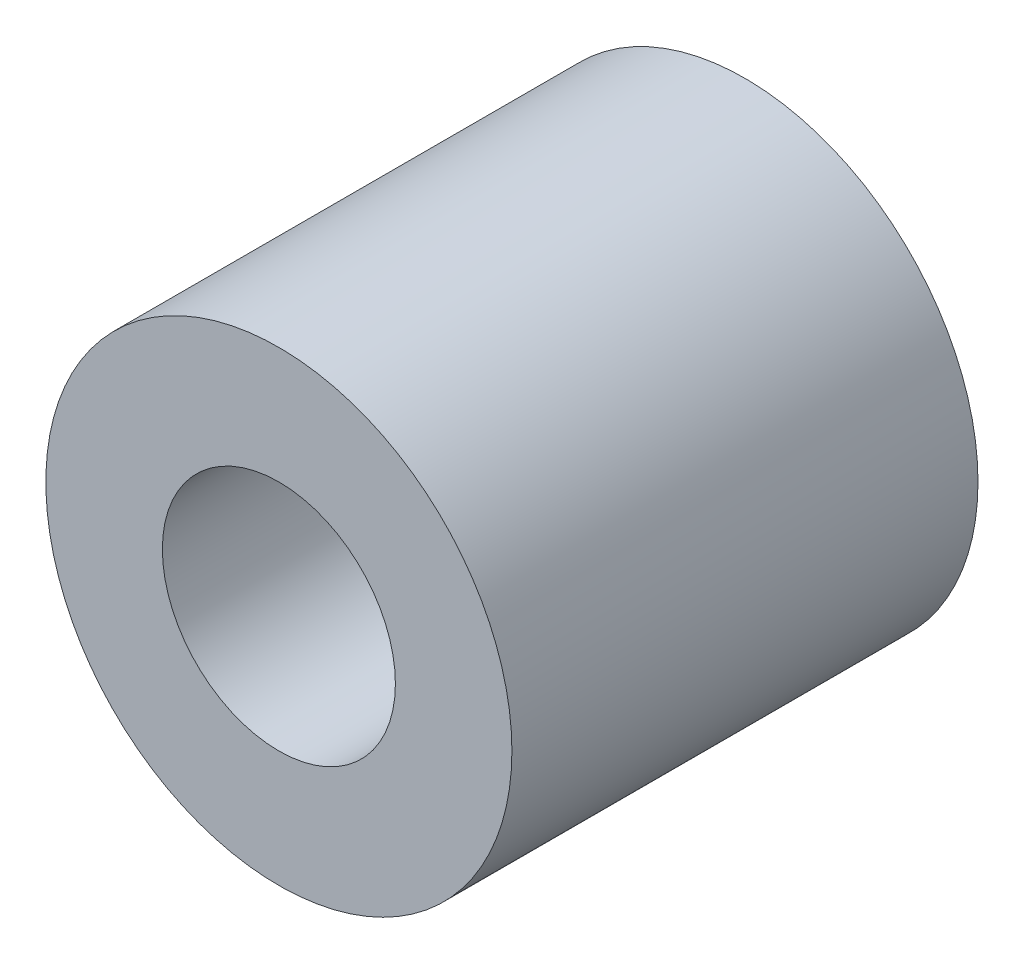
ISO-10303-21;
HEADER;
FILE_DESCRIPTION(('STEP AP214'),'2;1');
FILE_NAME('part.step','',(''),(''),'','','');
FILE_SCHEMA(('AUTOMOTIVE_DESIGN { 1 0 10303 214 1 1 1 1 }'));
ENDSEC;
DATA;
#1=APPLICATION_CONTEXT('core data for automotive mechanical design processes');
#2=APPLICATION_PROTOCOL_DEFINITION('international standard','automotive_design',2000,#1);
#3=PRODUCT_CONTEXT('',#1,'mechanical');
#4=PRODUCT('Part','Part','',(#3));
#5=PRODUCT_RELATED_PRODUCT_CATEGORY('part','',(#4));
#6=PRODUCT_DEFINITION_FORMATION('','',#4);
#7=PRODUCT_DEFINITION_CONTEXT('part definition',#1,'design');
#8=PRODUCT_DEFINITION('design','',#6,#7);
#9=PRODUCT_DEFINITION_SHAPE('','',#8);
#10=(LENGTH_UNIT() NAMED_UNIT(*) SI_UNIT(.MILLI.,.METRE.));
#11=(NAMED_UNIT(*) PLANE_ANGLE_UNIT() SI_UNIT($,.RADIAN.));
#12=(NAMED_UNIT(*) SI_UNIT($,.STERADIAN.) SOLID_ANGLE_UNIT());
#13=UNCERTAINTY_MEASURE_WITH_UNIT(LENGTH_MEASURE(1.E-05),#10,'distance_accuracy_value','');
#14=(GEOMETRIC_REPRESENTATION_CONTEXT(3) GLOBAL_UNCERTAINTY_ASSIGNED_CONTEXT((#13)) GLOBAL_UNIT_ASSIGNED_CONTEXT((#10,
#11,#12)) REPRESENTATION_CONTEXT('',''));
#15=CARTESIAN_POINT('',(0.,0.,0.));
#16=DIRECTION('',(0.,0.,1.));
#17=DIRECTION('',(1.,0.,0.));
#18=AXIS2_PLACEMENT_3D('',#15,#16,#17);
#19=CARTESIAN_POINT('',(0.,0.,40.));
#20=DIRECTION('',(0.,0.,1.));
#21=DIRECTION('',(1.,0.,0.));
#22=AXIS2_PLACEMENT_3D('',#19,#20,#21);
#23=PLANE('',#22);
#24=CARTESIAN_POINT('',(0.,0.,40.));
#25=DIRECTION('',(0.,0.,1.));
#26=DIRECTION('',(1.,0.,0.));
#27=AXIS2_PLACEMENT_3D('',#24,#25,#26);
#28=CIRCLE('',#27,20.);
#29=CARTESIAN_POINT('',(20.,0.,40.));
#30=VERTEX_POINT('',#29);
#31=EDGE_CURVE('E10',#30,#30,#28,.T.);
#32=ORIENTED_EDGE('',*,*,#31,.T.);
#33=EDGE_LOOP('',(#32));
#34=FACE_BOUND('',#33,.T.);
#35=CARTESIAN_POINT('',(0.,0.,40.));
#36=DIRECTION('',(0.,0.,1.));
#37=DIRECTION('',(1.,0.,0.));
#38=AXIS2_PLACEMENT_3D('',#35,#36,#37);
#39=CIRCLE('',#38,10.);
#40=CARTESIAN_POINT('',(10.,0.,40.));
#41=VERTEX_POINT('',#40);
#42=EDGE_CURVE('E42',#41,#41,#39,.T.);
#43=ORIENTED_EDGE('',*,*,#42,.F.);
#44=EDGE_LOOP('',(#43));
#45=FACE_BOUND('',#44,.T.);
#46=ADVANCED_FACE('F31',(#34,#45),#23,.T.);
#47=CARTESIAN_POINT('',(0.,0.,0.));
#48=DIRECTION('',(0.,0.,1.));
#49=DIRECTION('',(1.,0.,0.));
#50=AXIS2_PLACEMENT_3D('',#47,#48,#49);
#51=PLANE('',#50);
#52=CARTESIAN_POINT('',(0.,0.,0.));
#53=DIRECTION('',(0.,0.,1.));
#54=DIRECTION('',(1.,0.,0.));
#55=AXIS2_PLACEMENT_3D('',#52,#53,#54);
#56=CIRCLE('',#55,20.);
#57=CARTESIAN_POINT('',(20.,0.,0.));
#58=VERTEX_POINT('',#57);
#59=EDGE_CURVE('E35',#58,#58,#56,.T.);
#60=ORIENTED_EDGE('',*,*,#59,.F.);
#61=EDGE_LOOP('',(#60));
#62=FACE_BOUND('',#61,.T.);
#63=CARTESIAN_POINT('',(0.,0.,0.));
#64=DIRECTION('',(0.,0.,1.));
#65=DIRECTION('',(1.,0.,0.));
#66=AXIS2_PLACEMENT_3D('',#63,#64,#65);
#67=CIRCLE('',#66,10.);
#68=CARTESIAN_POINT('',(10.,0.,0.));
#69=VERTEX_POINT('',#68);
#70=EDGE_CURVE('E44',#69,#69,#67,.T.);
#71=ORIENTED_EDGE('',*,*,#70,.T.);
#72=EDGE_LOOP('',(#71));
#73=FACE_BOUND('',#72,.T.);
#74=ADVANCED_FACE('F54',(#62,#73),#51,.F.);
#75=CARTESIAN_POINT('',(0.,0.,40.));
#76=DIRECTION('',(0.,0.,-1.));
#77=DIRECTION('',(-1.,0.,0.));
#78=AXIS2_PLACEMENT_3D('',#75,#76,#77);
#79=CYLINDRICAL_SURFACE('',#78,20.);
#80=ORIENTED_EDGE('',*,*,#31,.F.);
#81=EDGE_LOOP('',(#80));
#82=FACE_BOUND('',#81,.T.);
#83=ORIENTED_EDGE('',*,*,#59,.T.);
#84=EDGE_LOOP('',(#83));
#85=FACE_BOUND('',#84,.T.);
#86=ADVANCED_FACE('F33',(#82,#85),#79,.T.);
#87=CARTESIAN_POINT('',(0.,0.,40.));
#88=DIRECTION('',(0.,0.,-1.));
#89=DIRECTION('',(-1.,0.,0.));
#90=AXIS2_PLACEMENT_3D('',#87,#88,#89);
#91=CYLINDRICAL_SURFACE('',#90,10.);
#92=ORIENTED_EDGE('',*,*,#42,.T.);
#93=EDGE_LOOP('',(#92));
#94=FACE_BOUND('',#93,.T.);
#95=ORIENTED_EDGE('',*,*,#70,.F.);
#96=EDGE_LOOP('',(#95));
#97=FACE_BOUND('',#96,.T.);
#98=ADVANCED_FACE('F50',(#94,#97),#91,.F.);
#99=CLOSED_SHELL('',(#46,#74,#86,#98));
#100=MANIFOLD_SOLID_BREP('B2',#99);
#101=ADVANCED_BREP_SHAPE_REPRESENTATION('',(#18,#100),#14);
#102=SHAPE_DEFINITION_REPRESENTATION(#9,#101);
ENDSEC;
END-ISO-10303-21;
